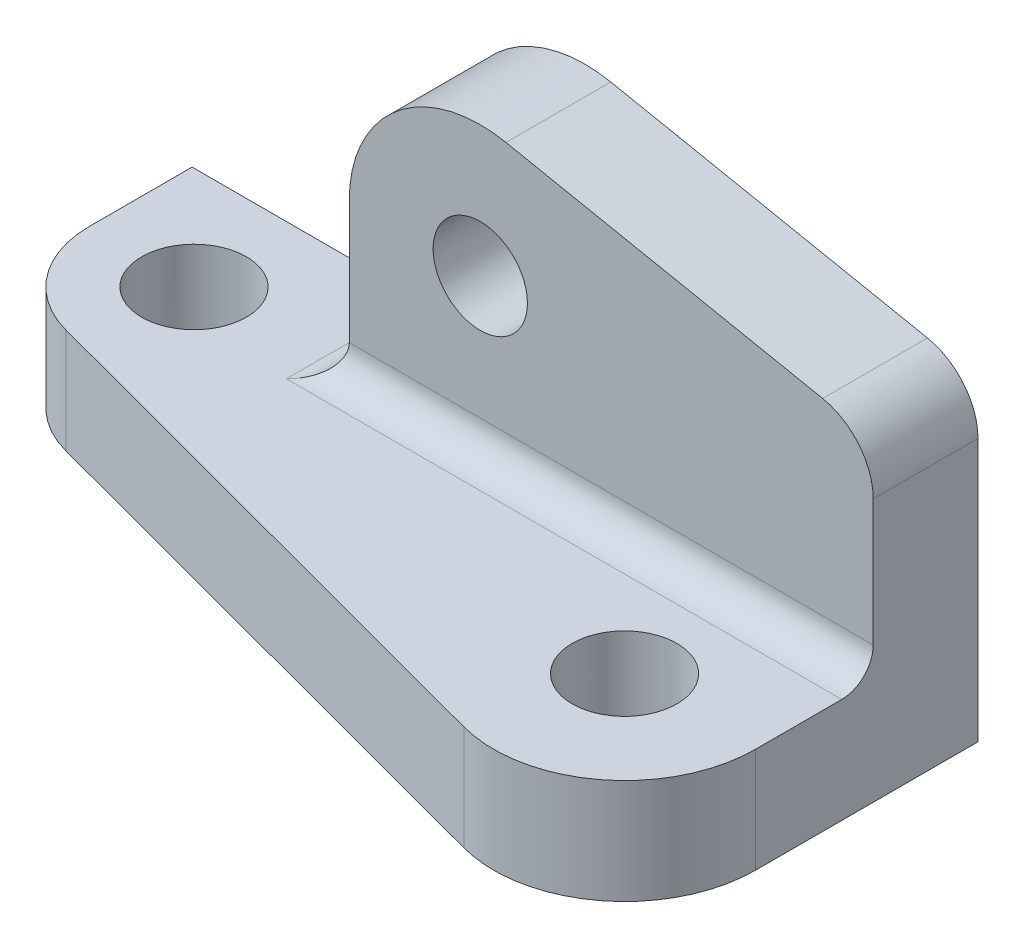
ISO-10303-21;
HEADER;
FILE_DESCRIPTION(('STEP AP214'),'2;1');
FILE_NAME('part.step','',(''),(''),'','','');
FILE_SCHEMA(('AUTOMOTIVE_DESIGN { 1 0 10303 214 1 1 1 1 }'));
ENDSEC;
DATA;
#1=APPLICATION_CONTEXT('core data for automotive mechanical design processes');
#2=APPLICATION_PROTOCOL_DEFINITION('international standard','automotive_design',2000,#1);
#3=PRODUCT_CONTEXT('',#1,'mechanical');
#4=PRODUCT('Part','Part','',(#3));
#5=PRODUCT_RELATED_PRODUCT_CATEGORY('part','',(#4));
#6=PRODUCT_DEFINITION_FORMATION('','',#4);
#7=PRODUCT_DEFINITION_CONTEXT('part definition',#1,'design');
#8=PRODUCT_DEFINITION('design','',#6,#7);
#9=PRODUCT_DEFINITION_SHAPE('','',#8);
#10=(LENGTH_UNIT() NAMED_UNIT(*) SI_UNIT(.MILLI.,.METRE.));
#11=(NAMED_UNIT(*) PLANE_ANGLE_UNIT() SI_UNIT($,.RADIAN.));
#12=(NAMED_UNIT(*) SI_UNIT($,.STERADIAN.) SOLID_ANGLE_UNIT());
#13=UNCERTAINTY_MEASURE_WITH_UNIT(LENGTH_MEASURE(1.E-05),#10,'distance_accuracy_value','');
#14=(GEOMETRIC_REPRESENTATION_CONTEXT(3) GLOBAL_UNCERTAINTY_ASSIGNED_CONTEXT((#13)) GLOBAL_UNIT_ASSIGNED_CONTEXT((#10,
#11,#12)) REPRESENTATION_CONTEXT('',''));
#15=CARTESIAN_POINT('',(0.,0.,0.));
#16=DIRECTION('',(0.,0.,1.));
#17=DIRECTION('',(1.,0.,0.));
#18=AXIS2_PLACEMENT_3D('',#15,#16,#17);
#19=CARTESIAN_POINT('',(0.,20.,0.));
#20=DIRECTION('',(0.,-1.,0.));
#21=DIRECTION('',(0.,0.,-1.));
#22=AXIS2_PLACEMENT_3D('',#19,#20,#21);
#23=PLANE('',#22);
#24=DIRECTION('',(-1.,0.,0.));
#25=VECTOR('',#24,1.);
#26=CARTESIAN_POINT('',(0.,20.,26.));
#27=LINE('',#26,#25);
#28=CARTESIAN_POINT('',(0.,20.,26.));
#29=VERTEX_POINT('',#28);
#30=CARTESIAN_POINT('',(-106.,20.,26.));
#31=VERTEX_POINT('',#30);
#32=EDGE_CURVE('E199',#29,#31,#27,.T.);
#33=ORIENTED_EDGE('',*,*,#32,.T.);
#34=DIRECTION('',(0.,0.,-1.));
#35=VECTOR('',#34,1.);
#36=CARTESIAN_POINT('',(-106.,20.,0.));
#37=LINE('',#36,#35);
#38=CARTESIAN_POINT('',(-106.,20.,0.));
#39=VERTEX_POINT('',#38);
#40=EDGE_CURVE('E138',#31,#39,#37,.T.);
#41=ORIENTED_EDGE('',*,*,#40,.T.);
#42=DIRECTION('',(-1.,0.,0.));
#43=VECTOR('',#42,1.);
#44=CARTESIAN_POINT('',(-150.,20.,0.));
#45=LINE('',#44,#43);
#46=CARTESIAN_POINT('',(-150.,20.,0.));
#47=VERTEX_POINT('',#46);
#48=EDGE_CURVE('E132',#39,#47,#45,.T.);
#49=ORIENTED_EDGE('',*,*,#48,.T.);
#50=DIRECTION('',(0.,0.,1.));
#51=VECTOR('',#50,1.);
#52=CARTESIAN_POINT('',(-150.,20.,35.));
#53=LINE('',#52,#51);
#54=CARTESIAN_POINT('',(-150.,20.,19.63443373832));
#55=VERTEX_POINT('',#54);
#56=EDGE_CURVE('E135',#47,#55,#53,.T.);
#57=ORIENTED_EDGE('',*,*,#56,.T.);
#58=CARTESIAN_POINT('',(-130.,20.,19.63443373832));
#59=DIRECTION('',(0.,-1.,0.));
#60=DIRECTION('',(0.,0.,-1.));
#61=AXIS2_PLACEMENT_3D('',#58,#59,#60);
#62=CIRCLE('',#61,20.);
#63=CARTESIAN_POINT('',(-135.153253011207,20.,38.9591325303449));
#64=VERTEX_POINT('',#63);
#65=EDGE_CURVE('E178',#55,#64,#62,.F.);
#66=ORIENTED_EDGE('',*,*,#65,.T.);
#67=DIRECTION('',(0.966234939601246,0.,0.257662650560332));
#68=VECTOR('',#67,1.);
#69=CARTESIAN_POINT('',(0.,20.,75.));
#70=LINE('',#69,#68);
#71=CARTESIAN_POINT('',(-31.4415662640083,20.,66.6155823295978));
#72=VERTEX_POINT('',#71);
#73=EDGE_CURVE('E149',#64,#72,#70,.T.);
#74=ORIENTED_EDGE('',*,*,#73,.T.);
#75=CARTESIAN_POINT('',(-25.,20.,42.4597088395666));
#76=DIRECTION('',(0.,-1.,0.));
#77=DIRECTION('',(0.,0.,-1.));
#78=AXIS2_PLACEMENT_3D('',#75,#76,#77);
#79=CIRCLE('',#78,25.);
#80=CARTESIAN_POINT('',(0.,20.,42.4597088395666));
#81=VERTEX_POINT('',#80);
#82=EDGE_CURVE('E197',#72,#81,#79,.F.);
#83=ORIENTED_EDGE('',*,*,#82,.T.);
#84=DIRECTION('',(0.,0.,-1.));
#85=VECTOR('',#84,1.);
#86=CARTESIAN_POINT('',(0.,20.,0.));
#87=LINE('',#86,#85);
#88=EDGE_CURVE('E162',#81,#29,#87,.T.);
#89=ORIENTED_EDGE('',*,*,#88,.T.);
#90=EDGE_LOOP('',(#33,#41,#49,#57,#66,#74,#83,#89));
#91=FACE_BOUND('',#90,.T.);
#92=CARTESIAN_POINT('',(-25.,20.,42.4597088395666));
#93=DIRECTION('',(0.,1.,0.));
#94=DIRECTION('',(0.,0.,1.));
#95=AXIS2_PLACEMENT_3D('',#92,#93,#94);
#96=CIRCLE('',#95,10.);
#97=CARTESIAN_POINT('',(-25.,20.,52.4597088395666));
#98=VERTEX_POINT('',#97);
#99=EDGE_CURVE('E227',#98,#98,#96,.T.);
#100=ORIENTED_EDGE('',*,*,#99,.F.);
#101=EDGE_LOOP('',(#100));
#102=FACE_BOUND('',#101,.T.);
#103=CARTESIAN_POINT('',(-130.,20.,19.63443373832));
#104=DIRECTION('',(0.,1.,0.));
#105=DIRECTION('',(0.,0.,1.));
#106=AXIS2_PLACEMENT_3D('',#103,#104,#105);
#107=CIRCLE('',#106,10.);
#108=CARTESIAN_POINT('',(-130.,20.,29.63443373832));
#109=VERTEX_POINT('',#108);
#110=EDGE_CURVE('E339',#109,#109,#107,.T.);
#111=ORIENTED_EDGE('',*,*,#110,.F.);
#112=EDGE_LOOP('',(#111));
#113=FACE_BOUND('',#112,.T.);
#114=ADVANCED_FACE('F39',(#91,#102,#113),#23,.F.);
#115=CARTESIAN_POINT('',(-150.,20.,0.));
#116=DIRECTION('',(0.,0.,1.));
#117=DIRECTION('',(1.,0.,0.));
#118=AXIS2_PLACEMENT_3D('',#115,#116,#117);
#119=PLANE('',#118);
#120=CARTESIAN_POINT('',(-75.,49.5049024320361,0.));
#121=DIRECTION('',(0.,0.,1.));
#122=DIRECTION('',(1.,0.,0.));
#123=AXIS2_PLACEMENT_3D('',#120,#121,#122);
#124=CIRCLE('',#123,8.99999999999999);
#125=CARTESIAN_POINT('',(-66.,49.5049024320361,0.));
#126=VERTEX_POINT('',#125);
#127=EDGE_CURVE('E334',#126,#126,#124,.T.);
#128=ORIENTED_EDGE('',*,*,#127,.T.);
#129=EDGE_LOOP('',(#128));
#130=FACE_BOUND('',#129,.T.);
#131=ORIENTED_EDGE('',*,*,#48,.F.);
#132=CARTESIAN_POINT('',(-106.,26.,0.));
#133=DIRECTION('',(0.,0.,1.));
#134=DIRECTION('',(1.,0.,0.));
#135=AXIS2_PLACEMENT_3D('',#132,#133,#134);
#136=CIRCLE('',#135,6.);
#137=CARTESIAN_POINT('',(-100.,26.,0.));
#138=VERTEX_POINT('',#137);
#139=EDGE_CURVE('E48',#39,#138,#136,.T.);
#140=ORIENTED_EDGE('',*,*,#139,.T.);
#141=DIRECTION('',(0.,1.,0.));
#142=VECTOR('',#141,1.);
#143=CARTESIAN_POINT('',(-100.,80.,0.));
#144=LINE('',#143,#142);
#145=CARTESIAN_POINT('',(-100.,49.5049024320361,0.));
#146=VERTEX_POINT('',#145);
#147=EDGE_CURVE('E209',#138,#146,#144,.T.);
#148=ORIENTED_EDGE('',*,*,#147,.T.);
#149=CARTESIAN_POINT('',(-75.,49.5049024320361,0.));
#150=DIRECTION('',(0.,0.,1.));
#151=DIRECTION('',(1.,0.,0.));
#152=AXIS2_PLACEMENT_3D('',#149,#150,#151);
#153=CIRCLE('',#152,25.);
#154=CARTESIAN_POINT('',(-70.0970966215454,74.0194193243091,0.));
#155=VERTEX_POINT('',#154);
#156=EDGE_CURVE('E183',#146,#155,#153,.F.);
#157=ORIENTED_EDGE('',*,*,#156,.T.);
#158=DIRECTION('',(0.98058067569092,-0.196116135138184,0.));
#159=VECTOR('',#158,1.);
#160=CARTESIAN_POINT('',(0.,60.,0.));
#161=LINE('',#160,#159);
#162=CARTESIAN_POINT('',(-9.64660637834179,61.9293212756684,0.));
#163=VERTEX_POINT('',#162);
#164=EDGE_CURVE('E217',#155,#163,#161,.T.);
#165=ORIENTED_EDGE('',*,*,#164,.T.);
#166=CARTESIAN_POINT('',(-12.,50.1623531673773,0.));
#167=DIRECTION('',(0.,0.,1.));
#168=DIRECTION('',(1.,0.,0.));
#169=AXIS2_PLACEMENT_3D('',#166,#167,#168);
#170=CIRCLE('',#169,12.);
#171=CARTESIAN_POINT('',(0.,50.1623531673773,0.));
#172=VERTEX_POINT('',#171);
#173=EDGE_CURVE('E160',#163,#172,#170,.F.);
#174=ORIENTED_EDGE('',*,*,#173,.T.);
#175=DIRECTION('',(0.,-1.,0.));
#176=VECTOR('',#175,1.);
#177=CARTESIAN_POINT('',(0.,20.,0.));
#178=LINE('',#177,#176);
#179=CARTESIAN_POINT('',(0.,0.,0.));
#180=VERTEX_POINT('',#179);
#181=EDGE_CURVE('E157',#172,#180,#178,.T.);
#182=ORIENTED_EDGE('',*,*,#181,.T.);
#183=DIRECTION('',(-1.,0.,0.));
#184=VECTOR('',#183,1.);
#185=CARTESIAN_POINT('',(-150.,0.,0.));
#186=LINE('',#185,#184);
#187=CARTESIAN_POINT('',(-150.,0.,0.));
#188=VERTEX_POINT('',#187);
#189=EDGE_CURVE('E154',#180,#188,#186,.T.);
#190=ORIENTED_EDGE('',*,*,#189,.T.);
#191=DIRECTION('',(0.,-1.,0.));
#192=VECTOR('',#191,1.);
#193=CARTESIAN_POINT('',(-150.,20.,0.));
#194=LINE('',#193,#192);
#195=EDGE_CURVE('E146',#47,#188,#194,.T.);
#196=ORIENTED_EDGE('',*,*,#195,.F.);
#197=EDGE_LOOP('',(#131,#140,#148,#157,#165,#174,#182,#190,#196));
#198=FACE_BOUND('',#197,.T.);
#199=ADVANCED_FACE('F151',(#130,#198),#119,.F.);
#200=CARTESIAN_POINT('',(-150.,20.,35.));
#201=DIRECTION('',(1.,0.,0.));
#202=DIRECTION('',(0.,0.,-1.));
#203=AXIS2_PLACEMENT_3D('',#200,#201,#202);
#204=PLANE('',#203);
#205=DIRECTION('',(0.,0.,1.));
#206=VECTOR('',#205,1.);
#207=CARTESIAN_POINT('',(-150.,0.,35.));
#208=LINE('',#207,#206);
#209=CARTESIAN_POINT('',(-150.,0.,19.63443373832));
#210=VERTEX_POINT('',#209);
#211=EDGE_CURVE('E245',#188,#210,#208,.T.);
#212=ORIENTED_EDGE('',*,*,#211,.T.);
#213=DIRECTION('',(0.,-1.,0.));
#214=VECTOR('',#213,1.);
#215=CARTESIAN_POINT('',(-150.,20.,19.63443373832));
#216=LINE('',#215,#214);
#217=EDGE_CURVE('E148',#210,#55,#216,.F.);
#218=ORIENTED_EDGE('',*,*,#217,.T.);
#219=ORIENTED_EDGE('',*,*,#56,.F.);
#220=ORIENTED_EDGE('',*,*,#195,.T.);
#221=EDGE_LOOP('',(#212,#218,#219,#220));
#222=FACE_BOUND('',#221,.T.);
#223=ADVANCED_FACE('F145',(#222),#204,.F.);
#224=CARTESIAN_POINT('',(0.,20.,75.));
#225=DIRECTION('',(0.257662650560332,0.,-0.966234939601246));
#226=DIRECTION('',(-0.966234939601246,0.,-0.257662650560332));
#227=AXIS2_PLACEMENT_3D('',#224,#225,#226);
#228=PLANE('',#227);
#229=DIRECTION('',(0.966234939601246,0.,0.257662650560332));
#230=VECTOR('',#229,1.);
#231=CARTESIAN_POINT('',(0.,0.,75.));
#232=LINE('',#231,#230);
#233=CARTESIAN_POINT('',(-135.153253011207,0.,38.9591325303449));
#234=VERTEX_POINT('',#233);
#235=CARTESIAN_POINT('',(-31.4415662640083,0.,66.6155823295978));
#236=VERTEX_POINT('',#235);
#237=EDGE_CURVE('E247',#234,#236,#232,.T.);
#238=ORIENTED_EDGE('',*,*,#237,.T.);
#239=DIRECTION('',(0.,-1.,0.));
#240=VECTOR('',#239,1.);
#241=CARTESIAN_POINT('',(-31.4415662640083,20.,66.6155823295978));
#242=LINE('',#241,#240);
#243=EDGE_CURVE('E195',#236,#72,#242,.F.);
#244=ORIENTED_EDGE('',*,*,#243,.T.);
#245=ORIENTED_EDGE('',*,*,#73,.F.);
#246=DIRECTION('',(0.,-1.,0.));
#247=VECTOR('',#246,1.);
#248=CARTESIAN_POINT('',(-135.153253011207,20.,38.9591325303449));
#249=LINE('',#248,#247);
#250=EDGE_CURVE('E172',#64,#234,#249,.T.);
#251=ORIENTED_EDGE('',*,*,#250,.T.);
#252=EDGE_LOOP('',(#238,#244,#245,#251));
#253=FACE_BOUND('',#252,.T.);
#254=ADVANCED_FACE('F266',(#253),#228,.F.);
#255=CARTESIAN_POINT('',(0.,20.,0.));
#256=DIRECTION('',(-1.,0.,0.));
#257=DIRECTION('',(0.,0.,1.));
#258=AXIS2_PLACEMENT_3D('',#255,#256,#257);
#259=PLANE('',#258);
#260=ORIENTED_EDGE('',*,*,#88,.F.);
#261=DIRECTION('',(0.,-1.,0.));
#262=VECTOR('',#261,1.);
#263=CARTESIAN_POINT('',(0.,20.,42.4597088395666));
#264=LINE('',#263,#262);
#265=CARTESIAN_POINT('',(0.,0.,42.4597088395666));
#266=VERTEX_POINT('',#265);
#267=EDGE_CURVE('E190',#81,#266,#264,.T.);
#268=ORIENTED_EDGE('',*,*,#267,.T.);
#269=DIRECTION('',(0.,0.,-1.));
#270=VECTOR('',#269,1.);
#271=CARTESIAN_POINT('',(0.,0.,0.));
#272=LINE('',#271,#270);
#273=EDGE_CURVE('E140',#266,#180,#272,.T.);
#274=ORIENTED_EDGE('',*,*,#273,.T.);
#275=ORIENTED_EDGE('',*,*,#181,.F.);
#276=DIRECTION('',(0.,0.,-1.));
#277=VECTOR('',#276,1.);
#278=CARTESIAN_POINT('',(0.,50.1623531673773,20.));
#279=LINE('',#278,#277);
#280=CARTESIAN_POINT('',(0.,50.1623531673773,20.));
#281=VERTEX_POINT('',#280);
#282=EDGE_CURVE('E167',#172,#281,#279,.F.);
#283=ORIENTED_EDGE('',*,*,#282,.T.);
#284=DIRECTION('',(0.,-1.,0.));
#285=VECTOR('',#284,1.);
#286=CARTESIAN_POINT('',(0.,0.,20.));
#287=LINE('',#286,#285);
#288=CARTESIAN_POINT('',(0.,26.,20.));
#289=VERTEX_POINT('',#288);
#290=EDGE_CURVE('E237',#281,#289,#287,.T.);
#291=ORIENTED_EDGE('',*,*,#290,.T.);
#292=CARTESIAN_POINT('',(0.,26.,26.));
#293=DIRECTION('',(-1.,0.,0.));
#294=DIRECTION('',(0.,0.,1.));
#295=AXIS2_PLACEMENT_3D('',#292,#293,#294);
#296=CIRCLE('',#295,6.);
#297=EDGE_CURVE('E11',#289,#29,#296,.T.);
#298=ORIENTED_EDGE('',*,*,#297,.T.);
#299=EDGE_LOOP('',(#260,#268,#274,#275,#283,#291,#298));
#300=FACE_BOUND('',#299,.T.);
#301=ADVANCED_FACE('F253',(#300),#259,.F.);
#302=CARTESIAN_POINT('',(0.,0.,0.));
#303=DIRECTION('',(0.,-1.,0.));
#304=DIRECTION('',(0.,0.,-1.));
#305=AXIS2_PLACEMENT_3D('',#302,#303,#304);
#306=PLANE('',#305);
#307=CARTESIAN_POINT('',(-130.,0.,19.63443373832));
#308=DIRECTION('',(0.,-1.,0.));
#309=DIRECTION('',(0.,0.,-1.));
#310=AXIS2_PLACEMENT_3D('',#307,#308,#309);
#311=CIRCLE('',#310,10.);
#312=CARTESIAN_POINT('',(-130.,0.,9.63443373831996));
#313=VERTEX_POINT('',#312);
#314=EDGE_CURVE('E232',#313,#313,#311,.T.);
#315=ORIENTED_EDGE('',*,*,#314,.F.);
#316=EDGE_LOOP('',(#315));
#317=FACE_BOUND('',#316,.T.);
#318=CARTESIAN_POINT('',(-25.,0.,42.4597088395666));
#319=DIRECTION('',(0.,-1.,0.));
#320=DIRECTION('',(0.,0.,-1.));
#321=AXIS2_PLACEMENT_3D('',#318,#319,#320);
#322=CIRCLE('',#321,10.);
#323=CARTESIAN_POINT('',(-25.,0.,32.4597088395666));
#324=VERTEX_POINT('',#323);
#325=EDGE_CURVE('E224',#324,#324,#322,.T.);
#326=ORIENTED_EDGE('',*,*,#325,.F.);
#327=EDGE_LOOP('',(#326));
#328=FACE_BOUND('',#327,.T.);
#329=ORIENTED_EDGE('',*,*,#273,.F.);
#330=CARTESIAN_POINT('',(-25.,0.,42.4597088395666));
#331=DIRECTION('',(0.,-1.,0.));
#332=DIRECTION('',(0.,0.,-1.));
#333=AXIS2_PLACEMENT_3D('',#330,#331,#332);
#334=CIRCLE('',#333,25.);
#335=EDGE_CURVE('E193',#266,#236,#334,.T.);
#336=ORIENTED_EDGE('',*,*,#335,.T.);
#337=ORIENTED_EDGE('',*,*,#237,.F.);
#338=CARTESIAN_POINT('',(-130.,0.,19.63443373832));
#339=DIRECTION('',(0.,-1.,0.));
#340=DIRECTION('',(0.,0.,-1.));
#341=AXIS2_PLACEMENT_3D('',#338,#339,#340);
#342=CIRCLE('',#341,20.);
#343=EDGE_CURVE('E175',#234,#210,#342,.T.);
#344=ORIENTED_EDGE('',*,*,#343,.T.);
#345=ORIENTED_EDGE('',*,*,#211,.F.);
#346=ORIENTED_EDGE('',*,*,#189,.F.);
#347=EDGE_LOOP('',(#329,#336,#337,#344,#345,#346));
#348=FACE_BOUND('',#347,.T.);
#349=ADVANCED_FACE('F258',(#317,#328,#348),#306,.T.);
#350=CARTESIAN_POINT('',(-100.,80.,20.));
#351=DIRECTION('',(-1.,0.,0.));
#352=DIRECTION('',(0.,-1.,0.));
#353=AXIS2_PLACEMENT_3D('',#350,#351,#352);
#354=PLANE('',#353);
#355=ORIENTED_EDGE('',*,*,#147,.F.);
#356=DIRECTION('',(0.,0.,-1.));
#357=VECTOR('',#356,1.);
#358=CARTESIAN_POINT('',(-100.,26.,20.));
#359=LINE('',#358,#357);
#360=CARTESIAN_POINT('',(-100.,26.,20.));
#361=VERTEX_POINT('',#360);
#362=EDGE_CURVE('E202',#138,#361,#359,.F.);
#363=ORIENTED_EDGE('',*,*,#362,.T.);
#364=DIRECTION('',(0.,1.,0.));
#365=VECTOR('',#364,1.);
#366=CARTESIAN_POINT('',(-100.,80.,20.));
#367=LINE('',#366,#365);
#368=CARTESIAN_POINT('',(-100.,49.5049024320361,20.));
#369=VERTEX_POINT('',#368);
#370=EDGE_CURVE('E208',#361,#369,#367,.T.);
#371=ORIENTED_EDGE('',*,*,#370,.T.);
#372=DIRECTION('',(0.,0.,-1.));
#373=VECTOR('',#372,1.);
#374=CARTESIAN_POINT('',(-100.,49.5049024320361,20.));
#375=LINE('',#374,#373);
#376=EDGE_CURVE('E180',#369,#146,#375,.T.);
#377=ORIENTED_EDGE('',*,*,#376,.T.);
#378=EDGE_LOOP('',(#355,#363,#371,#377));
#379=FACE_BOUND('',#378,.T.);
#380=ADVANCED_FACE('F207',(#379),#354,.T.);
#381=CARTESIAN_POINT('',(0.,0.,20.));
#382=DIRECTION('',(0.,0.,1.));
#383=DIRECTION('',(1.,0.,0.));
#384=AXIS2_PLACEMENT_3D('',#381,#382,#383);
#385=PLANE('',#384);
#386=CARTESIAN_POINT('',(-75.,49.5049024320361,20.));
#387=DIRECTION('',(0.,0.,1.));
#388=DIRECTION('',(1.,0.,0.));
#389=AXIS2_PLACEMENT_3D('',#386,#387,#388);
#390=CIRCLE('',#389,8.99999999999999);
#391=CARTESIAN_POINT('',(-66.,49.5049024320361,20.));
#392=VERTEX_POINT('',#391);
#393=EDGE_CURVE('E337',#392,#392,#390,.T.);
#394=ORIENTED_EDGE('',*,*,#393,.F.);
#395=EDGE_LOOP('',(#394));
#396=FACE_BOUND('',#395,.T.);
#397=ORIENTED_EDGE('',*,*,#370,.F.);
#398=DIRECTION('',(-1.,0.,0.));
#399=VECTOR('',#398,1.);
#400=CARTESIAN_POINT('',(0.,26.,20.));
#401=LINE('',#400,#399);
#402=EDGE_CURVE('E55',#361,#289,#401,.F.);
#403=ORIENTED_EDGE('',*,*,#402,.T.);
#404=ORIENTED_EDGE('',*,*,#290,.F.);
#405=CARTESIAN_POINT('',(-12.,50.1623531673773,20.));
#406=DIRECTION('',(0.,0.,1.));
#407=DIRECTION('',(1.,0.,0.));
#408=AXIS2_PLACEMENT_3D('',#405,#406,#407);
#409=CIRCLE('',#408,12.);
#410=CARTESIAN_POINT('',(-9.64660637834179,61.9293212756684,20.));
#411=VERTEX_POINT('',#410);
#412=EDGE_CURVE('E169',#281,#411,#409,.T.);
#413=ORIENTED_EDGE('',*,*,#412,.T.);
#414=DIRECTION('',(0.98058067569092,-0.196116135138184,0.));
#415=VECTOR('',#414,1.);
#416=CARTESIAN_POINT('',(0.,60.,20.));
#417=LINE('',#416,#415);
#418=CARTESIAN_POINT('',(-70.0970966215454,74.0194193243091,20.));
#419=VERTEX_POINT('',#418);
#420=EDGE_CURVE('E216',#419,#411,#417,.T.);
#421=ORIENTED_EDGE('',*,*,#420,.F.);
#422=CARTESIAN_POINT('',(-75.,49.5049024320361,20.));
#423=DIRECTION('',(0.,0.,1.));
#424=DIRECTION('',(1.,0.,0.));
#425=AXIS2_PLACEMENT_3D('',#422,#423,#424);
#426=CIRCLE('',#425,25.);
#427=EDGE_CURVE('E187',#419,#369,#426,.T.);
#428=ORIENTED_EDGE('',*,*,#427,.T.);
#429=EDGE_LOOP('',(#397,#403,#404,#413,#421,#428));
#430=FACE_BOUND('',#429,.T.);
#431=ADVANCED_FACE('F212',(#396,#430),#385,.T.);
#432=CARTESIAN_POINT('',(0.,60.,20.));
#433=DIRECTION('',(0.196116135138184,0.98058067569092,0.));
#434=DIRECTION('',(-0.98058067569092,0.196116135138184,0.));
#435=AXIS2_PLACEMENT_3D('',#432,#433,#434);
#436=PLANE('',#435);
#437=ORIENTED_EDGE('',*,*,#164,.F.);
#438=DIRECTION('',(0.,0.,-1.));
#439=VECTOR('',#438,1.);
#440=CARTESIAN_POINT('',(-70.0970966215454,74.0194193243091,20.));
#441=LINE('',#440,#439);
#442=EDGE_CURVE('E185',#155,#419,#441,.F.);
#443=ORIENTED_EDGE('',*,*,#442,.T.);
#444=ORIENTED_EDGE('',*,*,#420,.T.);
#445=DIRECTION('',(0.,0.,-1.));
#446=VECTOR('',#445,1.);
#447=CARTESIAN_POINT('',(-9.64660637834179,61.9293212756684,0.));
#448=LINE('',#447,#446);
#449=EDGE_CURVE('E156',#411,#163,#448,.T.);
#450=ORIENTED_EDGE('',*,*,#449,.T.);
#451=EDGE_LOOP('',(#437,#443,#444,#450));
#452=FACE_BOUND('',#451,.T.);
#453=ADVANCED_FACE('F276',(#452),#436,.T.);
#454=CARTESIAN_POINT('',(-12.,50.1623531673773,20.));
#455=DIRECTION('',(0.,0.,1.));
#456=DIRECTION('',(1.,0.,0.));
#457=AXIS2_PLACEMENT_3D('',#454,#455,#456);
#458=CYLINDRICAL_SURFACE('',#457,12.);
#459=ORIENTED_EDGE('',*,*,#412,.F.);
#460=ORIENTED_EDGE('',*,*,#282,.F.);
#461=ORIENTED_EDGE('',*,*,#173,.F.);
#462=ORIENTED_EDGE('',*,*,#449,.F.);
#463=EDGE_LOOP('',(#459,#460,#461,#462));
#464=FACE_BOUND('',#463,.T.);
#465=ADVANCED_FACE('F273',(#464),#458,.T.);
#466=CARTESIAN_POINT('',(-130.,20.,19.63443373832));
#467=DIRECTION('',(0.,-1.,0.));
#468=DIRECTION('',(0.,0.,-1.));
#469=AXIS2_PLACEMENT_3D('',#466,#467,#468);
#470=CYLINDRICAL_SURFACE('',#469,20.);
#471=ORIENTED_EDGE('',*,*,#65,.F.);
#472=ORIENTED_EDGE('',*,*,#217,.F.);
#473=ORIENTED_EDGE('',*,*,#343,.F.);
#474=ORIENTED_EDGE('',*,*,#250,.F.);
#475=EDGE_LOOP('',(#471,#472,#473,#474));
#476=FACE_BOUND('',#475,.T.);
#477=ADVANCED_FACE('F261',(#476),#470,.T.);
#478=CARTESIAN_POINT('',(-75.,49.5049024320361,20.));
#479=DIRECTION('',(0.,0.,-1.));
#480=DIRECTION('',(-1.,0.,0.));
#481=AXIS2_PLACEMENT_3D('',#478,#479,#480);
#482=CYLINDRICAL_SURFACE('',#481,25.);
#483=ORIENTED_EDGE('',*,*,#427,.F.);
#484=ORIENTED_EDGE('',*,*,#442,.F.);
#485=ORIENTED_EDGE('',*,*,#156,.F.);
#486=ORIENTED_EDGE('',*,*,#376,.F.);
#487=EDGE_LOOP('',(#483,#484,#485,#486));
#488=FACE_BOUND('',#487,.T.);
#489=ADVANCED_FACE('F279',(#488),#482,.T.);
#490=CARTESIAN_POINT('',(-25.,20.,42.4597088395666));
#491=DIRECTION('',(0.,-1.,0.));
#492=DIRECTION('',(0.,0.,-1.));
#493=AXIS2_PLACEMENT_3D('',#490,#491,#492);
#494=CYLINDRICAL_SURFACE('',#493,25.);
#495=ORIENTED_EDGE('',*,*,#82,.F.);
#496=ORIENTED_EDGE('',*,*,#243,.F.);
#497=ORIENTED_EDGE('',*,*,#335,.F.);
#498=ORIENTED_EDGE('',*,*,#267,.F.);
#499=EDGE_LOOP('',(#495,#496,#497,#498));
#500=FACE_BOUND('',#499,.T.);
#501=ADVANCED_FACE('F269',(#500),#494,.T.);
#502=CARTESIAN_POINT('',(0.,26.,26.));
#503=DIRECTION('',(-1.,0.,0.));
#504=DIRECTION('',(0.,0.,1.));
#505=AXIS2_PLACEMENT_3D('',#502,#503,#504);
#506=CYLINDRICAL_SURFACE('',#505,6.);
#507=ORIENTED_EDGE('',*,*,#297,.F.);
#508=ORIENTED_EDGE('',*,*,#402,.F.);
#509=CARTESIAN_POINT('',(-106.,26.,26.));
#510=DIRECTION('',(-0.707106781186547,0.,-0.707106781186547));
#511=DIRECTION('',(-0.707106781186547,0.,0.707106781186547));
#512=AXIS2_PLACEMENT_3D('',#509,#510,#511);
#513=ELLIPSE('',#512,8.48528137423857,6.);
#514=EDGE_CURVE('E43',#31,#361,#513,.F.);
#515=ORIENTED_EDGE('',*,*,#514,.F.);
#516=ORIENTED_EDGE('',*,*,#32,.F.);
#517=EDGE_LOOP('',(#507,#508,#515,#516));
#518=FACE_BOUND('',#517,.T.);
#519=ADVANCED_FACE('F41',(#518),#506,.F.);
#520=CARTESIAN_POINT('',(-106.,26.,0.));
#521=DIRECTION('',(0.,0.,-1.));
#522=DIRECTION('',(-1.,0.,0.));
#523=AXIS2_PLACEMENT_3D('',#520,#521,#522);
#524=CYLINDRICAL_SURFACE('',#523,6.);
#525=ORIENTED_EDGE('',*,*,#514,.T.);
#526=ORIENTED_EDGE('',*,*,#362,.F.);
#527=ORIENTED_EDGE('',*,*,#139,.F.);
#528=ORIENTED_EDGE('',*,*,#40,.F.);
#529=EDGE_LOOP('',(#525,#526,#527,#528));
#530=FACE_BOUND('',#529,.T.);
#531=ADVANCED_FACE('F223',(#530),#524,.F.);
#532=CARTESIAN_POINT('',(-25.,20.,42.4597088395666));
#533=DIRECTION('',(0.,1.,0.));
#534=DIRECTION('',(0.,0.,1.));
#535=AXIS2_PLACEMENT_3D('',#532,#533,#534);
#536=CYLINDRICAL_SURFACE('',#535,10.);
#537=ORIENTED_EDGE('',*,*,#99,.T.);
#538=EDGE_LOOP('',(#537));
#539=FACE_BOUND('',#538,.T.);
#540=ORIENTED_EDGE('',*,*,#325,.T.);
#541=EDGE_LOOP('',(#540));
#542=FACE_BOUND('',#541,.T.);
#543=ADVANCED_FACE('F318',(#539,#542),#536,.F.);
#544=CARTESIAN_POINT('',(-130.,20.,19.63443373832));
#545=DIRECTION('',(0.,1.,0.));
#546=DIRECTION('',(0.,0.,1.));
#547=AXIS2_PLACEMENT_3D('',#544,#545,#546);
#548=CYLINDRICAL_SURFACE('',#547,10.);
#549=ORIENTED_EDGE('',*,*,#110,.T.);
#550=EDGE_LOOP('',(#549));
#551=FACE_BOUND('',#550,.T.);
#552=ORIENTED_EDGE('',*,*,#314,.T.);
#553=EDGE_LOOP('',(#552));
#554=FACE_BOUND('',#553,.T.);
#555=ADVANCED_FACE('F321',(#551,#554),#548,.F.);
#556=CARTESIAN_POINT('',(-75.,49.5049024320361,20.));
#557=DIRECTION('',(0.,0.,1.));
#558=DIRECTION('',(1.,0.,0.));
#559=AXIS2_PLACEMENT_3D('',#556,#557,#558);
#560=CYLINDRICAL_SURFACE('',#559,8.99999999999999);
#561=ORIENTED_EDGE('',*,*,#127,.F.);
#562=EDGE_LOOP('',(#561));
#563=FACE_BOUND('',#562,.T.);
#564=ORIENTED_EDGE('',*,*,#393,.T.);
#565=EDGE_LOOP('',(#564));
#566=FACE_BOUND('',#565,.T.);
#567=ADVANCED_FACE('F325',(#563,#566),#560,.F.);
#568=CLOSED_SHELL('',(#114,#199,#223,#254,#301,#349,#380,#431,#453,#465,#477,#489,#501,#519,
#531,#543,#555,#567));
#569=MANIFOLD_SOLID_BREP('B2',#568);
#570=ADVANCED_BREP_SHAPE_REPRESENTATION('',(#18,#569),#14);
#571=SHAPE_DEFINITION_REPRESENTATION(#9,#570);
ENDSEC;
END-ISO-10303-21;
